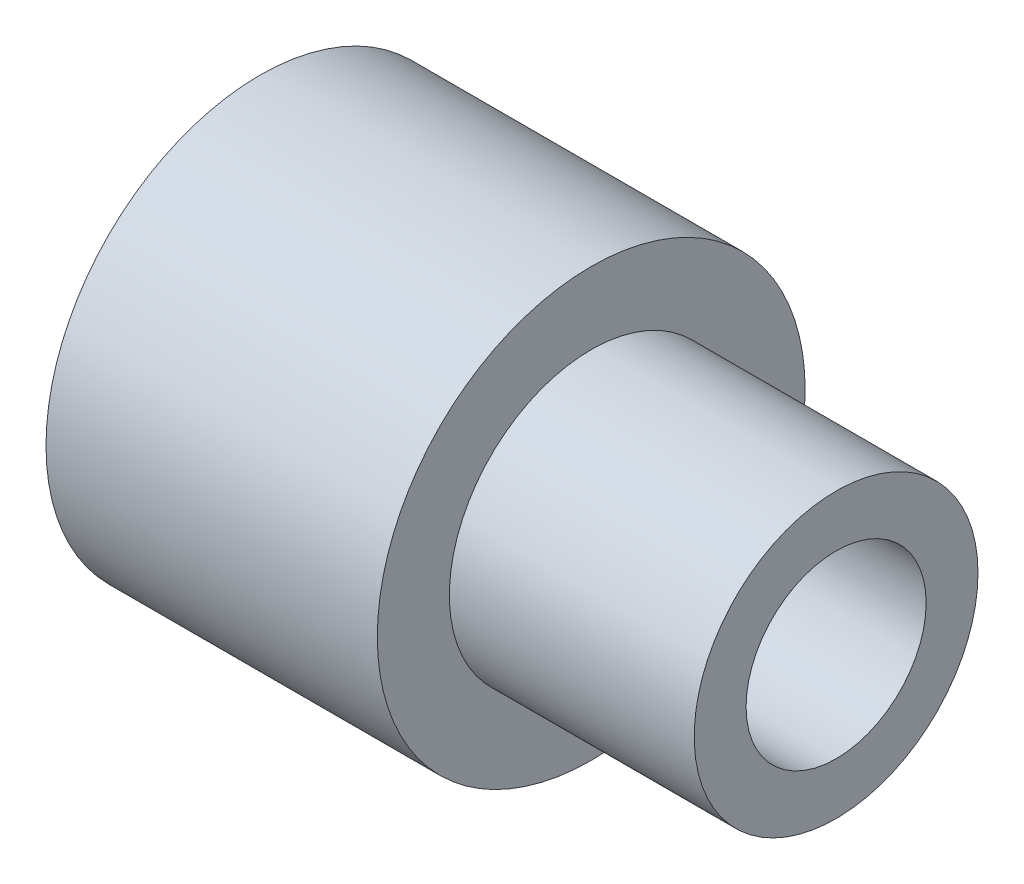
ISO-10303-21;
HEADER;
FILE_DESCRIPTION(('STEP AP214'),'2;1');
FILE_NAME('part.step','',(''),(''),'','','');
FILE_SCHEMA(('AUTOMOTIVE_DESIGN { 1 0 10303 214 1 1 1 1 }'));
ENDSEC;
DATA;
#1=APPLICATION_CONTEXT('core data for automotive mechanical design processes');
#2=APPLICATION_PROTOCOL_DEFINITION('international standard','automotive_design',2000,#1);
#3=PRODUCT_CONTEXT('',#1,'mechanical');
#4=PRODUCT('Part','Part','',(#3));
#5=PRODUCT_RELATED_PRODUCT_CATEGORY('part','',(#4));
#6=PRODUCT_DEFINITION_FORMATION('','',#4);
#7=PRODUCT_DEFINITION_CONTEXT('part definition',#1,'design');
#8=PRODUCT_DEFINITION('design','',#6,#7);
#9=PRODUCT_DEFINITION_SHAPE('','',#8);
#10=(LENGTH_UNIT() NAMED_UNIT(*) SI_UNIT(.MILLI.,.METRE.));
#11=(NAMED_UNIT(*) PLANE_ANGLE_UNIT() SI_UNIT($,.RADIAN.));
#12=(NAMED_UNIT(*) SI_UNIT($,.STERADIAN.) SOLID_ANGLE_UNIT());
#13=UNCERTAINTY_MEASURE_WITH_UNIT(LENGTH_MEASURE(1.E-05),#10,'distance_accuracy_value','');
#14=(GEOMETRIC_REPRESENTATION_CONTEXT(3) GLOBAL_UNCERTAINTY_ASSIGNED_CONTEXT((#13)) GLOBAL_UNIT_ASSIGNED_CONTEXT((#10,
#11,#12)) REPRESENTATION_CONTEXT('',''));
#15=CARTESIAN_POINT('',(0.,0.,0.));
#16=DIRECTION('',(0.,0.,1.));
#17=DIRECTION('',(1.,0.,0.));
#18=AXIS2_PLACEMENT_3D('',#15,#16,#17);
#19=CARTESIAN_POINT('',(5.842,0.,0.));
#20=DIRECTION('',(1.,0.,0.));
#21=DIRECTION('',(0.,0.,-1.));
#22=AXIS2_PLACEMENT_3D('',#19,#20,#21);
#23=PLANE('',#22);
#24=CARTESIAN_POINT('',(5.842,0.,0.));
#25=DIRECTION('',(1.,0.,0.));
#26=DIRECTION('',(0.,0.,-1.));
#27=AXIS2_PLACEMENT_3D('',#24,#25,#26);
#28=CIRCLE('',#27,3.7719);
#29=CARTESIAN_POINT('',(5.842,0.,-3.7719));
#30=VERTEX_POINT('',#29);
#31=EDGE_CURVE('E10',#30,#30,#28,.T.);
#32=ORIENTED_EDGE('',*,*,#31,.T.);
#33=EDGE_LOOP('',(#32));
#34=FACE_BOUND('',#33,.T.);
#35=CARTESIAN_POINT('',(5.842,0.,0.));
#36=DIRECTION('',(1.,0.,0.));
#37=DIRECTION('',(0.,0.,-1.));
#38=AXIS2_PLACEMENT_3D('',#35,#36,#37);
#39=CIRCLE('',#38,2.5019);
#40=CARTESIAN_POINT('',(5.842,0.,-2.5019));
#41=VERTEX_POINT('',#40);
#42=EDGE_CURVE('E44',#41,#41,#39,.T.);
#43=ORIENTED_EDGE('',*,*,#42,.F.);
#44=EDGE_LOOP('',(#43));
#45=FACE_BOUND('',#44,.T.);
#46=ADVANCED_FACE('F31',(#34,#45),#23,.T.);
#47=CARTESIAN_POINT('',(5.842,0.,0.));
#48=DIRECTION('',(-1.,0.,0.));
#49=DIRECTION('',(0.,0.,1.));
#50=AXIS2_PLACEMENT_3D('',#47,#48,#49);
#51=CYLINDRICAL_SURFACE('',#50,3.7719);
#52=ORIENTED_EDGE('',*,*,#31,.F.);
#53=EDGE_LOOP('',(#52));
#54=FACE_BOUND('',#53,.T.);
#55=CARTESIAN_POINT('',(0.,0.,0.));
#56=DIRECTION('',(1.,0.,0.));
#57=DIRECTION('',(0.,0.,-1.));
#58=AXIS2_PLACEMENT_3D('',#55,#56,#57);
#59=CIRCLE('',#58,3.7719);
#60=CARTESIAN_POINT('',(0.,0.,-3.7719));
#61=VERTEX_POINT('',#60);
#62=EDGE_CURVE('E35',#61,#61,#59,.T.);
#63=ORIENTED_EDGE('',*,*,#62,.T.);
#64=EDGE_LOOP('',(#63));
#65=FACE_BOUND('',#64,.T.);
#66=ADVANCED_FACE('F33',(#54,#65),#51,.T.);
#67=CARTESIAN_POINT('',(0.,0.,0.));
#68=DIRECTION('',(1.,0.,0.));
#69=DIRECTION('',(0.,0.,-1.));
#70=AXIS2_PLACEMENT_3D('',#67,#68,#69);
#71=PLANE('',#70);
#72=CARTESIAN_POINT('',(0.,0.,0.));
#73=DIRECTION('',(1.,0.,0.));
#74=DIRECTION('',(0.,0.,-1.));
#75=AXIS2_PLACEMENT_3D('',#72,#73,#74);
#76=CIRCLE('',#75,1.5875);
#77=CARTESIAN_POINT('',(0.,0.,-1.5875));
#78=VERTEX_POINT('',#77);
#79=EDGE_CURVE('E47',#78,#78,#76,.T.);
#80=ORIENTED_EDGE('',*,*,#79,.T.);
#81=EDGE_LOOP('',(#80));
#82=FACE_BOUND('',#81,.T.);
#83=ORIENTED_EDGE('',*,*,#62,.F.);
#84=EDGE_LOOP('',(#83));
#85=FACE_BOUND('',#84,.T.);
#86=ADVANCED_FACE('F56',(#82,#85),#71,.F.);
#87=CARTESIAN_POINT('',(10.16,0.,0.));
#88=DIRECTION('',(-1.,0.,0.));
#89=DIRECTION('',(0.,0.,1.));
#90=AXIS2_PLACEMENT_3D('',#87,#88,#89);
#91=CYLINDRICAL_SURFACE('',#90,2.5019);
#92=CARTESIAN_POINT('',(10.16,0.,0.));
#93=DIRECTION('',(1.,0.,0.));
#94=DIRECTION('',(0.,0.,-1.));
#95=AXIS2_PLACEMENT_3D('',#92,#93,#94);
#96=CIRCLE('',#95,2.5019);
#97=CARTESIAN_POINT('',(10.16,0.,-2.5019));
#98=VERTEX_POINT('',#97);
#99=EDGE_CURVE('E42',#98,#98,#96,.T.);
#100=ORIENTED_EDGE('',*,*,#99,.F.);
#101=EDGE_LOOP('',(#100));
#102=FACE_BOUND('',#101,.T.);
#103=ORIENTED_EDGE('',*,*,#42,.T.);
#104=EDGE_LOOP('',(#103));
#105=FACE_BOUND('',#104,.T.);
#106=ADVANCED_FACE('F68',(#102,#105),#91,.T.);
#107=CARTESIAN_POINT('',(10.16,0.,0.));
#108=DIRECTION('',(1.,0.,0.));
#109=DIRECTION('',(0.,0.,-1.));
#110=AXIS2_PLACEMENT_3D('',#107,#108,#109);
#111=PLANE('',#110);
#112=CARTESIAN_POINT('',(10.16,0.,0.));
#113=DIRECTION('',(1.,0.,0.));
#114=DIRECTION('',(0.,0.,-1.));
#115=AXIS2_PLACEMENT_3D('',#112,#113,#114);
#116=CIRCLE('',#115,1.5875);
#117=CARTESIAN_POINT('',(10.16,0.,-1.5875));
#118=VERTEX_POINT('',#117);
#119=EDGE_CURVE('E50',#118,#118,#116,.T.);
#120=ORIENTED_EDGE('',*,*,#119,.F.);
#121=EDGE_LOOP('',(#120));
#122=FACE_BOUND('',#121,.T.);
#123=ORIENTED_EDGE('',*,*,#99,.T.);
#124=EDGE_LOOP('',(#123));
#125=FACE_BOUND('',#124,.T.);
#126=ADVANCED_FACE('F62',(#122,#125),#111,.T.);
#127=CARTESIAN_POINT('',(0.,0.,0.));
#128=DIRECTION('',(1.,0.,0.));
#129=DIRECTION('',(0.,0.,-1.));
#130=AXIS2_PLACEMENT_3D('',#127,#128,#129);
#131=CYLINDRICAL_SURFACE('',#130,1.5875);
#132=ORIENTED_EDGE('',*,*,#79,.F.);
#133=EDGE_LOOP('',(#132));
#134=FACE_BOUND('',#133,.T.);
#135=ORIENTED_EDGE('',*,*,#119,.T.);
#136=EDGE_LOOP('',(#135));
#137=FACE_BOUND('',#136,.T.);
#138=ADVANCED_FACE('F59',(#134,#137),#131,.F.);
#139=CLOSED_SHELL('',(#46,#66,#86,#106,#126,#138));
#140=MANIFOLD_SOLID_BREP('B2',#139);
#141=ADVANCED_BREP_SHAPE_REPRESENTATION('',(#18,#140),#14);
#142=SHAPE_DEFINITION_REPRESENTATION(#9,#141);
ENDSEC;
END-ISO-10303-21;
